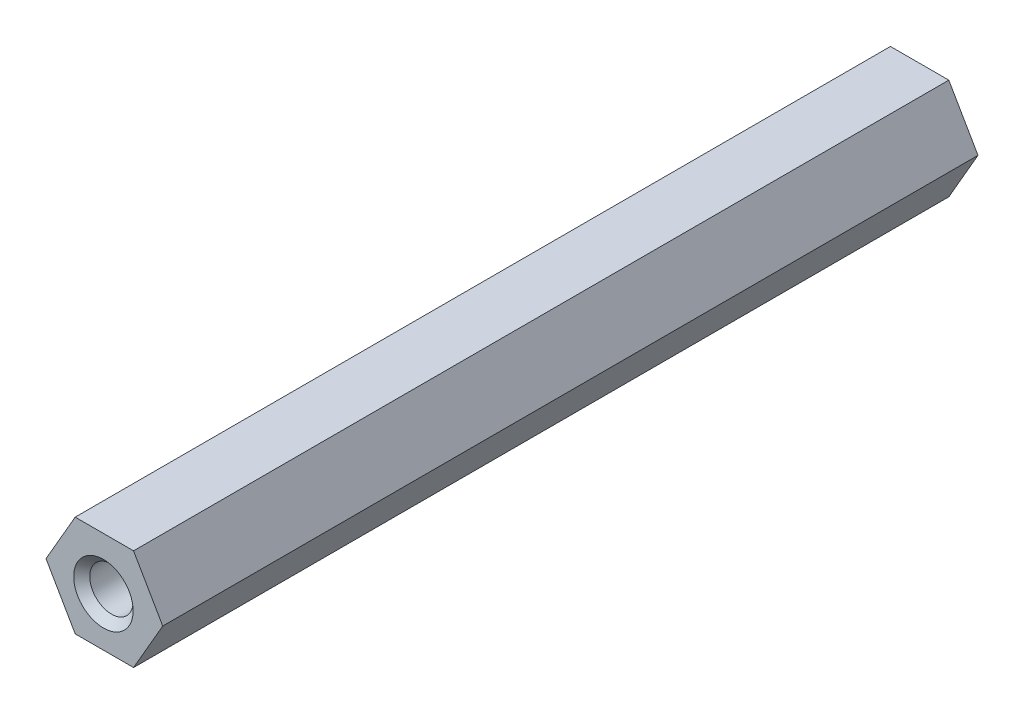
ISO-10303-21;
HEADER;
FILE_DESCRIPTION(('STEP AP214'),'2;1');
FILE_NAME('part.step','',(''),(''),'','','');
FILE_SCHEMA(('AUTOMOTIVE_DESIGN { 1 0 10303 214 1 1 1 1 }'));
ENDSEC;
DATA;
#1=APPLICATION_CONTEXT('core data for automotive mechanical design processes');
#2=APPLICATION_PROTOCOL_DEFINITION('international standard','automotive_design',2000,#1);
#3=PRODUCT_CONTEXT('',#1,'mechanical');
#4=PRODUCT('Part','Part','',(#3));
#5=PRODUCT_RELATED_PRODUCT_CATEGORY('part','',(#4));
#6=PRODUCT_DEFINITION_FORMATION('','',#4);
#7=PRODUCT_DEFINITION_CONTEXT('part definition',#1,'design');
#8=PRODUCT_DEFINITION('design','',#6,#7);
#9=PRODUCT_DEFINITION_SHAPE('','',#8);
#10=(LENGTH_UNIT() NAMED_UNIT(*) SI_UNIT(.MILLI.,.METRE.));
#11=(NAMED_UNIT(*) PLANE_ANGLE_UNIT() SI_UNIT($,.RADIAN.));
#12=(NAMED_UNIT(*) SI_UNIT($,.STERADIAN.) SOLID_ANGLE_UNIT());
#13=UNCERTAINTY_MEASURE_WITH_UNIT(LENGTH_MEASURE(1.E-05),#10,'distance_accuracy_value','');
#14=(GEOMETRIC_REPRESENTATION_CONTEXT(3) GLOBAL_UNCERTAINTY_ASSIGNED_CONTEXT((#13)) GLOBAL_UNIT_ASSIGNED_CONTEXT((#10,
#11,#12)) REPRESENTATION_CONTEXT('',''));
#15=CARTESIAN_POINT('',(0.,0.,0.));
#16=DIRECTION('',(0.,0.,1.));
#17=DIRECTION('',(1.,0.,0.));
#18=AXIS2_PLACEMENT_3D('',#15,#16,#17);
#19=CARTESIAN_POINT('',(1.81865334794732,-3.15,-25.4));
#20=DIRECTION('',(0.866025403784439,-0.5,0.));
#21=DIRECTION('',(0.5,0.866025403784439,0.));
#22=AXIS2_PLACEMENT_3D('',#19,#20,#21);
#23=PLANE('',#22);
#24=DIRECTION('',(0.5,0.866025403784438,0.));
#25=VECTOR('',#24,1.);
#26=CARTESIAN_POINT('',(1.81865334794732,-3.15,25.4));
#27=LINE('',#26,#25);
#28=CARTESIAN_POINT('',(1.81865334794732,-3.15,25.4));
#29=VERTEX_POINT('',#28);
#30=CARTESIAN_POINT('',(3.63730669589464,0.,25.4));
#31=VERTEX_POINT('',#30);
#32=EDGE_CURVE('E123',#29,#31,#27,.T.);
#33=ORIENTED_EDGE('',*,*,#32,.F.);
#34=DIRECTION('',(0.,0.,1.));
#35=VECTOR('',#34,1.);
#36=CARTESIAN_POINT('',(1.81865334794732,-3.15,-25.4));
#37=LINE('',#36,#35);
#38=CARTESIAN_POINT('',(1.81865334794732,-3.15,-25.4));
#39=VERTEX_POINT('',#38);
#40=EDGE_CURVE('E52',#39,#29,#37,.T.);
#41=ORIENTED_EDGE('',*,*,#40,.F.);
#42=DIRECTION('',(0.5,0.866025403784438,0.));
#43=VECTOR('',#42,1.);
#44=CARTESIAN_POINT('',(1.81865334794732,-3.15,-25.4));
#45=LINE('',#44,#43);
#46=CARTESIAN_POINT('',(3.63730669589464,0.,-25.4));
#47=VERTEX_POINT('',#46);
#48=EDGE_CURVE('E138',#39,#47,#45,.T.);
#49=ORIENTED_EDGE('',*,*,#48,.T.);
#50=DIRECTION('',(0.,0.,1.));
#51=VECTOR('',#50,1.);
#52=CARTESIAN_POINT('',(3.63730669589464,0.,-25.4));
#53=LINE('',#52,#51);
#54=EDGE_CURVE('E87',#47,#31,#53,.T.);
#55=ORIENTED_EDGE('',*,*,#54,.T.);
#56=EDGE_LOOP('',(#33,#41,#49,#55));
#57=FACE_BOUND('',#56,.T.);
#58=ADVANCED_FACE('F35',(#57),#23,.T.);
#59=CARTESIAN_POINT('',(-1.81865334794732,-3.15,-25.4));
#60=DIRECTION('',(0.,-1.,0.));
#61=DIRECTION('',(1.,0.,0.));
#62=AXIS2_PLACEMENT_3D('',#59,#60,#61);
#63=PLANE('',#62);
#64=DIRECTION('',(1.,0.,0.));
#65=VECTOR('',#64,1.);
#66=CARTESIAN_POINT('',(-1.81865334794732,-3.15,25.4));
#67=LINE('',#66,#65);
#68=CARTESIAN_POINT('',(-1.81865334794732,-3.15,25.4));
#69=VERTEX_POINT('',#68);
#70=EDGE_CURVE('E135',#69,#29,#67,.T.);
#71=ORIENTED_EDGE('',*,*,#70,.F.);
#72=DIRECTION('',(0.,0.,1.));
#73=VECTOR('',#72,1.);
#74=CARTESIAN_POINT('',(-1.81865334794732,-3.15,-25.4));
#75=LINE('',#74,#73);
#76=CARTESIAN_POINT('',(-1.81865334794732,-3.15,-25.4));
#77=VERTEX_POINT('',#76);
#78=EDGE_CURVE('E75',#77,#69,#75,.T.);
#79=ORIENTED_EDGE('',*,*,#78,.F.);
#80=DIRECTION('',(1.,0.,0.));
#81=VECTOR('',#80,1.);
#82=CARTESIAN_POINT('',(-1.81865334794732,-3.15,-25.4));
#83=LINE('',#82,#81);
#84=EDGE_CURVE('E113',#77,#39,#83,.T.);
#85=ORIENTED_EDGE('',*,*,#84,.T.);
#86=ORIENTED_EDGE('',*,*,#40,.T.);
#87=EDGE_LOOP('',(#71,#79,#85,#86));
#88=FACE_BOUND('',#87,.T.);
#89=ADVANCED_FACE('F164',(#88),#63,.T.);
#90=CARTESIAN_POINT('',(-3.63730669589464,0.,-25.4));
#91=DIRECTION('',(-0.866025403784439,-0.5,0.));
#92=DIRECTION('',(0.5,-0.866025403784439,0.));
#93=AXIS2_PLACEMENT_3D('',#90,#91,#92);
#94=PLANE('',#93);
#95=DIRECTION('',(0.5,-0.866025403784439,0.));
#96=VECTOR('',#95,1.);
#97=CARTESIAN_POINT('',(-3.63730669589464,0.,25.4));
#98=LINE('',#97,#96);
#99=CARTESIAN_POINT('',(-3.63730669589464,0.,25.4));
#100=VERTEX_POINT('',#99);
#101=EDGE_CURVE('E100',#100,#69,#98,.T.);
#102=ORIENTED_EDGE('',*,*,#101,.F.);
#103=DIRECTION('',(0.,0.,1.));
#104=VECTOR('',#103,1.);
#105=CARTESIAN_POINT('',(-3.63730669589464,0.,-25.4));
#106=LINE('',#105,#104);
#107=CARTESIAN_POINT('',(-3.63730669589464,0.,-25.4));
#108=VERTEX_POINT('',#107);
#109=EDGE_CURVE('E95',#108,#100,#106,.T.);
#110=ORIENTED_EDGE('',*,*,#109,.F.);
#111=DIRECTION('',(0.5,-0.866025403784439,0.));
#112=VECTOR('',#111,1.);
#113=CARTESIAN_POINT('',(-3.63730669589464,0.,-25.4));
#114=LINE('',#113,#112);
#115=EDGE_CURVE('E98',#108,#77,#114,.T.);
#116=ORIENTED_EDGE('',*,*,#115,.T.);
#117=ORIENTED_EDGE('',*,*,#78,.T.);
#118=EDGE_LOOP('',(#102,#110,#116,#117));
#119=FACE_BOUND('',#118,.T.);
#120=ADVANCED_FACE('F97',(#119),#94,.T.);
#121=CARTESIAN_POINT('',(-1.81865334794732,3.15,-25.4));
#122=DIRECTION('',(-0.866025403784439,0.5,0.));
#123=DIRECTION('',(-0.5,-0.866025403784439,0.));
#124=AXIS2_PLACEMENT_3D('',#121,#122,#123);
#125=PLANE('',#124);
#126=DIRECTION('',(-0.5,-0.866025403784438,0.));
#127=VECTOR('',#126,1.);
#128=CARTESIAN_POINT('',(-1.81865334794732,3.15,25.4));
#129=LINE('',#128,#127);
#130=CARTESIAN_POINT('',(-1.81865334794732,3.15,25.4));
#131=VERTEX_POINT('',#130);
#132=EDGE_CURVE('E132',#131,#100,#129,.T.);
#133=ORIENTED_EDGE('',*,*,#132,.F.);
#134=DIRECTION('',(0.,0.,1.));
#135=VECTOR('',#134,1.);
#136=CARTESIAN_POINT('',(-1.81865334794732,3.15,-25.4));
#137=LINE('',#136,#135);
#138=CARTESIAN_POINT('',(-1.81865334794732,3.15,-25.4));
#139=VERTEX_POINT('',#138);
#140=EDGE_CURVE('E105',#139,#131,#137,.T.);
#141=ORIENTED_EDGE('',*,*,#140,.F.);
#142=DIRECTION('',(-0.5,-0.866025403784438,0.));
#143=VECTOR('',#142,1.);
#144=CARTESIAN_POINT('',(-1.81865334794732,3.15,-25.4));
#145=LINE('',#144,#143);
#146=EDGE_CURVE('E111',#139,#108,#145,.T.);
#147=ORIENTED_EDGE('',*,*,#146,.T.);
#148=ORIENTED_EDGE('',*,*,#109,.T.);
#149=EDGE_LOOP('',(#133,#141,#147,#148));
#150=FACE_BOUND('',#149,.T.);
#151=ADVANCED_FACE('F115',(#150),#125,.T.);
#152=CARTESIAN_POINT('',(1.81865334794732,3.15,-25.4));
#153=DIRECTION('',(0.,1.,0.));
#154=DIRECTION('',(0.,0.,1.));
#155=AXIS2_PLACEMENT_3D('',#152,#153,#154);
#156=PLANE('',#155);
#157=DIRECTION('',(-1.,0.,0.));
#158=VECTOR('',#157,1.);
#159=CARTESIAN_POINT('',(1.81865334794732,3.15,25.4));
#160=LINE('',#159,#158);
#161=CARTESIAN_POINT('',(1.81865334794732,3.15,25.4));
#162=VERTEX_POINT('',#161);
#163=EDGE_CURVE('E129',#162,#131,#160,.T.);
#164=ORIENTED_EDGE('',*,*,#163,.F.);
#165=DIRECTION('',(0.,0.,1.));
#166=VECTOR('',#165,1.);
#167=CARTESIAN_POINT('',(1.81865334794732,3.15,-25.4));
#168=LINE('',#167,#166);
#169=CARTESIAN_POINT('',(1.81865334794732,3.15,-25.4));
#170=VERTEX_POINT('',#169);
#171=EDGE_CURVE('E143',#170,#162,#168,.T.);
#172=ORIENTED_EDGE('',*,*,#171,.F.);
#173=DIRECTION('',(-1.,0.,0.));
#174=VECTOR('',#173,1.);
#175=CARTESIAN_POINT('',(1.81865334794732,3.15,-25.4));
#176=LINE('',#175,#174);
#177=EDGE_CURVE('E116',#170,#139,#176,.T.);
#178=ORIENTED_EDGE('',*,*,#177,.T.);
#179=ORIENTED_EDGE('',*,*,#140,.T.);
#180=EDGE_LOOP('',(#164,#172,#178,#179));
#181=FACE_BOUND('',#180,.T.);
#182=ADVANCED_FACE('F174',(#181),#156,.T.);
#183=CARTESIAN_POINT('',(3.63730669589464,0.,-25.4));
#184=DIRECTION('',(0.866025403784438,0.5,0.));
#185=DIRECTION('',(-0.5,0.866025403784438,0.));
#186=AXIS2_PLACEMENT_3D('',#183,#184,#185);
#187=PLANE('',#186);
#188=DIRECTION('',(-0.5,0.866025403784438,0.));
#189=VECTOR('',#188,1.);
#190=CARTESIAN_POINT('',(3.63730669589464,0.,25.4));
#191=LINE('',#190,#189);
#192=EDGE_CURVE('E126',#31,#162,#191,.T.);
#193=ORIENTED_EDGE('',*,*,#192,.F.);
#194=ORIENTED_EDGE('',*,*,#54,.F.);
#195=DIRECTION('',(-0.5,0.866025403784438,0.));
#196=VECTOR('',#195,1.);
#197=CARTESIAN_POINT('',(3.63730669589464,0.,-25.4));
#198=LINE('',#197,#196);
#199=EDGE_CURVE('E118',#47,#170,#198,.T.);
#200=ORIENTED_EDGE('',*,*,#199,.T.);
#201=ORIENTED_EDGE('',*,*,#171,.T.);
#202=EDGE_LOOP('',(#193,#194,#200,#201));
#203=FACE_BOUND('',#202,.T.);
#204=ADVANCED_FACE('F171',(#203),#187,.T.);
#205=CARTESIAN_POINT('',(3.63730669589464,0.,-25.4));
#206=DIRECTION('',(0.,0.,1.));
#207=DIRECTION('',(1.,0.,0.));
#208=AXIS2_PLACEMENT_3D('',#205,#206,#207);
#209=PLANE('',#208);
#210=CARTESIAN_POINT('',(-0.0587533379232065,-0.101763766397256,-25.4));
#211=DIRECTION('',(0.,0.,1.));
#212=DIRECTION('',(1.,0.,0.));
#213=AXIS2_PLACEMENT_3D('',#210,#211,#212);
#214=CIRCLE('',#213,1.85254999999999);
#215=CARTESIAN_POINT('',(1.79379666207678,-0.101763766397256,-25.4));
#216=VERTEX_POINT('',#215);
#217=EDGE_CURVE('E44',#216,#216,#214,.T.);
#218=ORIENTED_EDGE('',*,*,#217,.T.);
#219=EDGE_LOOP('',(#218));
#220=FACE_BOUND('',#219,.T.);
#221=ORIENTED_EDGE('',*,*,#48,.F.);
#222=ORIENTED_EDGE('',*,*,#84,.F.);
#223=ORIENTED_EDGE('',*,*,#115,.F.);
#224=ORIENTED_EDGE('',*,*,#146,.F.);
#225=ORIENTED_EDGE('',*,*,#177,.F.);
#226=ORIENTED_EDGE('',*,*,#199,.F.);
#227=EDGE_LOOP('',(#221,#222,#223,#224,#225,#226));
#228=FACE_BOUND('',#227,.T.);
#229=ADVANCED_FACE('F109',(#220,#228),#209,.F.);
#230=CARTESIAN_POINT('',(3.63730669589464,0.,25.4));
#231=DIRECTION('',(0.,0.,1.));
#232=DIRECTION('',(1.,0.,0.));
#233=AXIS2_PLACEMENT_3D('',#230,#231,#232);
#234=PLANE('',#233);
#235=CARTESIAN_POINT('',(-0.0587533379232065,-0.101763766397256,25.4));
#236=DIRECTION('',(0.,0.,1.));
#237=DIRECTION('',(1.,0.,0.));
#238=AXIS2_PLACEMENT_3D('',#235,#236,#237);
#239=CIRCLE('',#238,1.85254999999998);
#240=CARTESIAN_POINT('',(1.79379666207677,-0.101763766397256,25.4));
#241=VERTEX_POINT('',#240);
#242=EDGE_CURVE('E148',#241,#241,#239,.F.);
#243=ORIENTED_EDGE('',*,*,#242,.T.);
#244=EDGE_LOOP('',(#243));
#245=FACE_BOUND('',#244,.T.);
#246=ORIENTED_EDGE('',*,*,#32,.T.);
#247=ORIENTED_EDGE('',*,*,#192,.T.);
#248=ORIENTED_EDGE('',*,*,#163,.T.);
#249=ORIENTED_EDGE('',*,*,#132,.T.);
#250=ORIENTED_EDGE('',*,*,#101,.T.);
#251=ORIENTED_EDGE('',*,*,#70,.T.);
#252=EDGE_LOOP('',(#246,#247,#248,#249,#250,#251));
#253=FACE_BOUND('',#252,.T.);
#254=ADVANCED_FACE('F182',(#245,#253),#234,.T.);
#255=CARTESIAN_POINT('',(-0.0587533379232065,-0.101763766397256,25.4));
#256=DIRECTION('',(0.,0.,1.));
#257=DIRECTION('',(1.,0.,0.));
#258=AXIS2_PLACEMENT_3D('',#255,#256,#257);
#259=CYLINDRICAL_SURFACE('',#258,1.35254999999999);
#260=CARTESIAN_POINT('',(-0.0587533379232065,-0.101763766397256,-24.9));
#261=DIRECTION('',(0.,0.,1.));
#262=DIRECTION('',(1.,0.,0.));
#263=AXIS2_PLACEMENT_3D('',#260,#261,#262);
#264=CIRCLE('',#263,1.35254999999999);
#265=CARTESIAN_POINT('',(1.29379666207678,-0.101763766397256,-24.9));
#266=VERTEX_POINT('',#265);
#267=EDGE_CURVE('E11',#266,#266,#264,.F.);
#268=ORIENTED_EDGE('',*,*,#267,.T.);
#269=EDGE_LOOP('',(#268));
#270=FACE_BOUND('',#269,.T.);
#271=CARTESIAN_POINT('',(-0.0587533379232065,-0.101763766397256,24.9));
#272=DIRECTION('',(0.,0.,1.));
#273=DIRECTION('',(1.,0.,0.));
#274=AXIS2_PLACEMENT_3D('',#271,#272,#273);
#275=CIRCLE('',#274,1.35254999999999);
#276=CARTESIAN_POINT('',(1.29379666207678,-0.101763766397256,24.9));
#277=VERTEX_POINT('',#276);
#278=EDGE_CURVE('E140',#277,#277,#275,.T.);
#279=ORIENTED_EDGE('',*,*,#278,.T.);
#280=EDGE_LOOP('',(#279));
#281=FACE_BOUND('',#280,.T.);
#282=ADVANCED_FACE('F160',(#270,#281),#259,.F.);
#283=CARTESIAN_POINT('',(-0.0587533379232065,-0.101763766397256,24.9));
#284=DIRECTION('',(0.,0.,1.));
#285=DIRECTION('',(1.,0.,0.));
#286=AXIS2_PLACEMENT_3D('',#283,#284,#285);
#287=CONICAL_SURFACE('',#286,1.35254999999999,0.785398163397456);
#288=ORIENTED_EDGE('',*,*,#242,.F.);
#289=EDGE_LOOP('',(#288));
#290=FACE_BOUND('',#289,.T.);
#291=ORIENTED_EDGE('',*,*,#278,.F.);
#292=EDGE_LOOP('',(#291));
#293=FACE_BOUND('',#292,.T.);
#294=ADVANCED_FACE('F155',(#290,#293),#287,.F.);
#295=CARTESIAN_POINT('',(-0.0587533379232065,-0.101763766397256,-25.4));
#296=DIRECTION('',(0.,0.,-1.));
#297=DIRECTION('',(-1.,0.,0.));
#298=AXIS2_PLACEMENT_3D('',#295,#296,#297);
#299=CONICAL_SURFACE('',#298,1.85254999999999,0.785398163397439);
#300=ORIENTED_EDGE('',*,*,#267,.F.);
#301=EDGE_LOOP('',(#300));
#302=FACE_BOUND('',#301,.T.);
#303=ORIENTED_EDGE('',*,*,#217,.F.);
#304=EDGE_LOOP('',(#303));
#305=FACE_BOUND('',#304,.T.);
#306=ADVANCED_FACE('F37',(#302,#305),#299,.F.);
#307=CLOSED_SHELL('',(#58,#89,#120,#151,#182,#204,#229,#254,#282,#294,#306));
#308=MANIFOLD_SOLID_BREP('B2',#307);
#309=ADVANCED_BREP_SHAPE_REPRESENTATION('',(#18,#308),#14);
#310=SHAPE_DEFINITION_REPRESENTATION(#9,#309);
ENDSEC;
END-ISO-10303-21;
